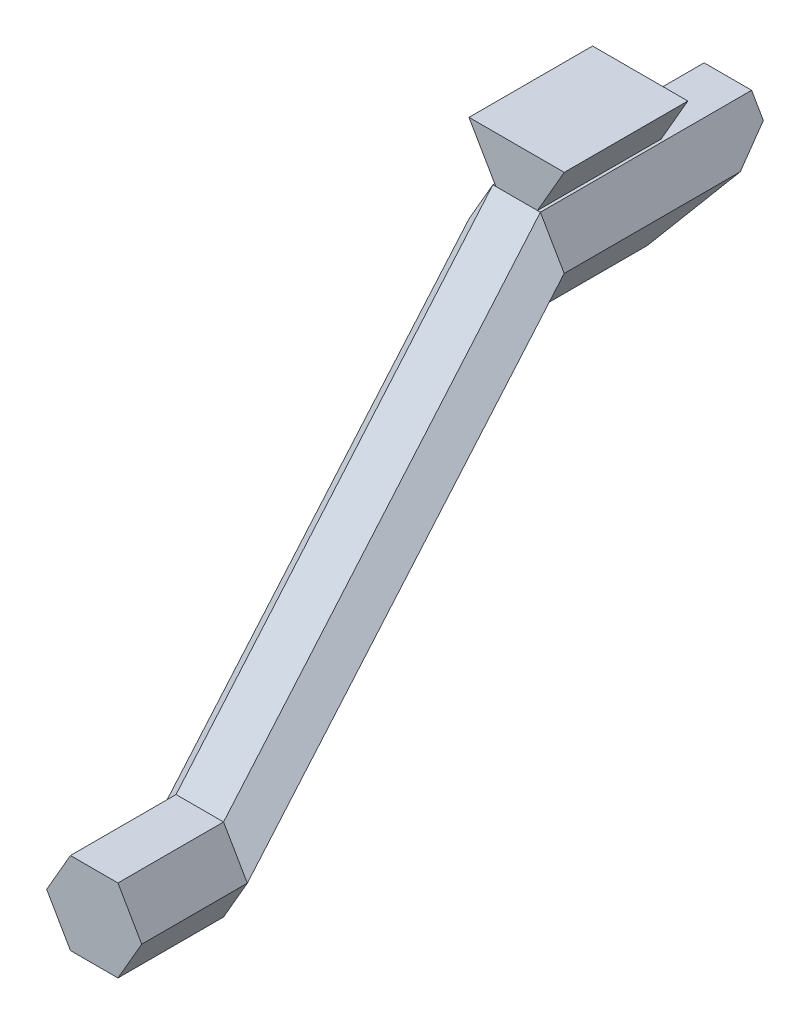
ISO-10303-21;
HEADER;
FILE_DESCRIPTION(('STEP AP214'),'2;1');
FILE_NAME('part.step','',(''),(''),'','','');
FILE_SCHEMA(('AUTOMOTIVE_DESIGN { 1 0 10303 214 1 1 1 1 }'));
ENDSEC;
DATA;
#1=APPLICATION_CONTEXT('core data for automotive mechanical design processes');
#2=APPLICATION_PROTOCOL_DEFINITION('international standard','automotive_design',2000,#1);
#3=PRODUCT_CONTEXT('',#1,'mechanical');
#4=PRODUCT('Part','Part','',(#3));
#5=PRODUCT_RELATED_PRODUCT_CATEGORY('part','',(#4));
#6=PRODUCT_DEFINITION_FORMATION('','',#4);
#7=PRODUCT_DEFINITION_CONTEXT('part definition',#1,'design');
#8=PRODUCT_DEFINITION('design','',#6,#7);
#9=PRODUCT_DEFINITION_SHAPE('','',#8);
#10=(LENGTH_UNIT() NAMED_UNIT(*) SI_UNIT(.MILLI.,.METRE.));
#11=(NAMED_UNIT(*) PLANE_ANGLE_UNIT() SI_UNIT($,.RADIAN.));
#12=(NAMED_UNIT(*) SI_UNIT($,.STERADIAN.) SOLID_ANGLE_UNIT());
#13=UNCERTAINTY_MEASURE_WITH_UNIT(LENGTH_MEASURE(1.E-05),#10,'distance_accuracy_value','');
#14=(GEOMETRIC_REPRESENTATION_CONTEXT(3) GLOBAL_UNCERTAINTY_ASSIGNED_CONTEXT((#13)) GLOBAL_UNIT_ASSIGNED_CONTEXT((#10,
#11,#12)) REPRESENTATION_CONTEXT('',''));
#15=CARTESIAN_POINT('',(0.,0.,0.));
#16=DIRECTION('',(0.,0.,1.));
#17=DIRECTION('',(1.,0.,0.));
#18=AXIS2_PLACEMENT_3D('',#15,#16,#17);
#19=CARTESIAN_POINT('',(2.85750000000006,-4.94933518262803,25.4));
#20=DIRECTION('',(-0.866025403784442,0.499999999999995,0.));
#21=DIRECTION('',(-0.499999999999995,-0.866025403784442,0.));
#22=AXIS2_PLACEMENT_3D('',#19,#20,#21);
#23=PLANE('',#22);
#24=DIRECTION('',(0.,0.,-1.));
#25=VECTOR('',#24,1.);
#26=CARTESIAN_POINT('',(2.85750000000006,-4.94933518262803,25.4));
#27=LINE('',#26,#25);
#28=CARTESIAN_POINT('',(2.85750000000002,-4.94933518262805,25.4));
#29=VERTEX_POINT('',#28);
#30=CARTESIAN_POINT('',(2.85750000000006,-4.94933518262803,12.5400000000001));
#31=VERTEX_POINT('',#30);
#32=EDGE_CURVE('E426',#29,#31,#27,.T.);
#33=ORIENTED_EDGE('',*,*,#32,.T.);
#34=DIRECTION('',(-0.283104064772028,-0.490350624014429,0.824262309000124));
#35=VECTOR('',#34,1.);
#36=CARTESIAN_POINT('',(2.39945468583216,-5.74269293893569,13.8736067378148));
#37=LINE('',#36,#35);
#38=CARTESIAN_POINT('',(5.715,0.,4.22034005493903));
#39=VERTEX_POINT('',#38);
#40=EDGE_CURVE('E337',#31,#39,#37,.F.);
#41=ORIENTED_EDGE('',*,*,#40,.T.);
#42=DIRECTION('',(0.,0.,-1.));
#43=VECTOR('',#42,1.);
#44=CARTESIAN_POINT('',(5.715,0.,25.4));
#45=LINE('',#44,#43);
#46=CARTESIAN_POINT('',(5.71499999999998,0.,25.4));
#47=VERTEX_POINT('',#46);
#48=EDGE_CURVE('E338',#47,#39,#45,.T.);
#49=ORIENTED_EDGE('',*,*,#48,.F.);
#50=DIRECTION('',(0.500000000000003,0.866025403784437,0.));
#51=VECTOR('',#50,1.);
#52=CARTESIAN_POINT('',(2.85750000000002,-4.94933518262801,25.4));
#53=LINE('',#52,#51);
#54=EDGE_CURVE('E433',#29,#47,#53,.T.);
#55=ORIENTED_EDGE('',*,*,#54,.F.);
#56=EDGE_LOOP('',(#33,#41,#49,#55));
#57=FACE_BOUND('',#56,.T.);
#58=ADVANCED_FACE('F47',(#57),#23,.F.);
#59=CARTESIAN_POINT('',(5.715,0.,25.4));
#60=DIRECTION('',(-0.866025403784438,-0.500000000000001,0.));
#61=DIRECTION('',(0.500000000000001,-0.866025403784438,0.));
#62=AXIS2_PLACEMENT_3D('',#59,#60,#61);
#63=PLANE('',#62);
#64=ORIENTED_EDGE('',*,*,#48,.T.);
#65=DIRECTION('',(0.283104064772029,-0.490350624014424,0.824262309000126));
#66=VECTOR('',#65,1.);
#67=CARTESIAN_POINT('',(7.65640937166418,-3.36261967001273,9.87278652437068));
#68=LINE('',#67,#66);
#69=CARTESIAN_POINT('',(4.26546699184535,2.510664817372,0.));
#70=VERTEX_POINT('',#69);
#71=EDGE_CURVE('E340',#39,#70,#68,.F.);
#72=ORIENTED_EDGE('',*,*,#71,.T.);
#73=DIRECTION('',(-0.500000000000001,0.866025403784438,0.));
#74=VECTOR('',#73,1.);
#75=CARTESIAN_POINT('',(5.715,0.,0.));
#76=LINE('',#75,#74);
#77=CARTESIAN_POINT('',(2.85749999999999,4.94933518262807,0.));
#78=VERTEX_POINT('',#77);
#79=EDGE_CURVE('E310',#70,#78,#76,.T.);
#80=ORIENTED_EDGE('',*,*,#79,.T.);
#81=DIRECTION('',(0.,0.,-1.));
#82=VECTOR('',#81,1.);
#83=CARTESIAN_POINT('',(2.85749999999999,4.94933518262807,25.4));
#84=LINE('',#83,#82);
#85=CARTESIAN_POINT('',(2.85749999999999,4.94933518262807,25.4));
#86=VERTEX_POINT('',#85);
#87=EDGE_CURVE('E424',#86,#78,#84,.T.);
#88=ORIENTED_EDGE('',*,*,#87,.F.);
#89=DIRECTION('',(-0.499999999999991,0.866025403784444,0.));
#90=VECTOR('',#89,1.);
#91=CARTESIAN_POINT('',(5.71499999999994,0.,25.4));
#92=LINE('',#91,#90);
#93=EDGE_CURVE('E436',#47,#86,#92,.T.);
#94=ORIENTED_EDGE('',*,*,#93,.F.);
#95=EDGE_LOOP('',(#64,#72,#80,#88,#94));
#96=FACE_BOUND('',#95,.T.);
#97=ADVANCED_FACE('F382',(#96),#63,.F.);
#98=CARTESIAN_POINT('',(-2.85750000000002,4.94933518262805,25.4));
#99=DIRECTION('',(0.866025403784441,-0.499999999999995,0.));
#100=DIRECTION('',(0.499999999999995,0.866025403784441,0.));
#101=AXIS2_PLACEMENT_3D('',#98,#99,#100);
#102=PLANE('',#101);
#103=DIRECTION('',(-0.499999999999995,-0.866025403784441,0.));
#104=VECTOR('',#103,1.);
#105=CARTESIAN_POINT('',(-2.85750000000002,4.94933518262805,0.));
#106=LINE('',#105,#104);
#107=CARTESIAN_POINT('',(-2.85750000000002,4.94933518262805,0.));
#108=VERTEX_POINT('',#107);
#109=CARTESIAN_POINT('',(-4.2654669918454,2.51066481737191,0.));
#110=VERTEX_POINT('',#109);
#111=EDGE_CURVE('E414',#108,#110,#106,.T.);
#112=ORIENTED_EDGE('',*,*,#111,.T.);
#113=DIRECTION('',(0.283104064772028,0.490350624014429,-0.824262309000124));
#114=VECTOR('',#113,1.);
#115=CARTESIAN_POINT('',(-8.11445468583209,-4.15597742632049,11.2063932621853));
#116=LINE('',#115,#114);
#117=CARTESIAN_POINT('',(-5.715,0.,4.2203400549389));
#118=VERTEX_POINT('',#117);
#119=EDGE_CURVE('E344',#110,#118,#116,.F.);
#120=ORIENTED_EDGE('',*,*,#119,.T.);
#121=DIRECTION('',(0.,0.,-1.));
#122=VECTOR('',#121,1.);
#123=CARTESIAN_POINT('',(-5.715,0.,25.4));
#124=LINE('',#123,#122);
#125=CARTESIAN_POINT('',(-5.715,0.,25.4));
#126=VERTEX_POINT('',#125);
#127=EDGE_CURVE('E411',#126,#118,#124,.T.);
#128=ORIENTED_EDGE('',*,*,#127,.F.);
#129=DIRECTION('',(-0.499999999999995,-0.866025403784441,0.));
#130=VECTOR('',#129,1.);
#131=CARTESIAN_POINT('',(-2.85750000000002,4.94933518262805,25.4));
#132=LINE('',#131,#130);
#133=CARTESIAN_POINT('',(-2.85750000000002,4.94933518262805,25.4));
#134=VERTEX_POINT('',#133);
#135=EDGE_CURVE('E441',#134,#126,#132,.T.);
#136=ORIENTED_EDGE('',*,*,#135,.F.);
#137=DIRECTION('',(0.,0.,-1.));
#138=VECTOR('',#137,1.);
#139=CARTESIAN_POINT('',(-2.85750000000002,4.94933518262805,25.4));
#140=LINE('',#139,#138);
#141=EDGE_CURVE('E421',#134,#108,#140,.T.);
#142=ORIENTED_EDGE('',*,*,#141,.T.);
#143=EDGE_LOOP('',(#112,#120,#128,#136,#142));
#144=FACE_BOUND('',#143,.T.);
#145=ADVANCED_FACE('F388',(#144),#102,.F.);
#146=CARTESIAN_POINT('',(-5.715,0.,25.4));
#147=DIRECTION('',(0.866025403784434,0.500000000000007,0.));
#148=DIRECTION('',(-0.500000000000007,0.866025403784435,0.));
#149=AXIS2_PLACEMENT_3D('',#146,#147,#148);
#150=PLANE('',#149);
#151=ORIENTED_EDGE('',*,*,#127,.T.);
#152=DIRECTION('',(-0.283104064772034,0.490350624014423,-0.824262309000125));
#153=VECTOR('',#152,1.);
#154=CARTESIAN_POINT('',(-2.85749999999995,-4.94933518262809,12.5400000000001));
#155=LINE('',#154,#153);
#156=CARTESIAN_POINT('',(-2.85749999999995,-4.94933518262809,12.5400000000001));
#157=VERTEX_POINT('',#156);
#158=EDGE_CURVE('E346',#118,#157,#155,.F.);
#159=ORIENTED_EDGE('',*,*,#158,.T.);
#160=DIRECTION('',(0.,0.,-1.));
#161=VECTOR('',#160,1.);
#162=CARTESIAN_POINT('',(-2.85749999999995,-4.94933518262809,25.4));
#163=LINE('',#162,#161);
#164=CARTESIAN_POINT('',(-2.85749999999995,-4.94933518262809,25.4));
#165=VERTEX_POINT('',#164);
#166=EDGE_CURVE('E422',#165,#157,#163,.T.);
#167=ORIENTED_EDGE('',*,*,#166,.F.);
#168=DIRECTION('',(0.500000000000007,-0.866025403784435,0.));
#169=VECTOR('',#168,1.);
#170=CARTESIAN_POINT('',(-5.715,0.,25.4));
#171=LINE('',#170,#169);
#172=EDGE_CURVE('E419',#126,#165,#171,.T.);
#173=ORIENTED_EDGE('',*,*,#172,.F.);
#174=EDGE_LOOP('',(#151,#159,#167,#173));
#175=FACE_BOUND('',#174,.T.);
#176=ADVANCED_FACE('F416',(#175),#150,.F.);
#177=CARTESIAN_POINT('',(-2.85749999999995,-4.94933518262809,25.4));
#178=DIRECTION('',(0.,1.,0.));
#179=DIRECTION('',(-1.,0.,0.));
#180=AXIS2_PLACEMENT_3D('',#177,#178,#179);
#181=PLANE('',#180);
#182=ORIENTED_EDGE('',*,*,#166,.T.);
#183=DIRECTION('',(1.,0.,0.));
#184=VECTOR('',#183,1.);
#185=CARTESIAN_POINT('',(-2.85749999999995,-4.94933518262809,12.5400000000001));
#186=LINE('',#185,#184);
#187=EDGE_CURVE('E334',#157,#31,#186,.T.);
#188=ORIENTED_EDGE('',*,*,#187,.T.);
#189=ORIENTED_EDGE('',*,*,#32,.F.);
#190=DIRECTION('',(1.,0.,0.));
#191=VECTOR('',#190,1.);
#192=CARTESIAN_POINT('',(-1.01546060534387E-13,-4.94933518262808,25.4));
#193=LINE('',#192,#191);
#194=EDGE_CURVE('E437',#165,#29,#193,.T.);
#195=ORIENTED_EDGE('',*,*,#194,.F.);
#196=EDGE_LOOP('',(#182,#188,#189,#195));
#197=FACE_BOUND('',#196,.T.);
#198=ADVANCED_FACE('F513',(#197),#181,.F.);
#199=CARTESIAN_POINT('',(0.,0.,0.));
#200=DIRECTION('',(0.,0.,1.));
#201=DIRECTION('',(1.,0.,0.));
#202=AXIS2_PLACEMENT_3D('',#199,#200,#201);
#203=PLANE('',#202);
#204=ORIENTED_EDGE('',*,*,#111,.F.);
#205=DIRECTION('',(-1.,0.,0.));
#206=VECTOR('',#205,1.);
#207=CARTESIAN_POINT('',(-2.85750000000002,4.94933518262805,0.));
#208=LINE('',#207,#206);
#209=EDGE_CURVE('E213',#78,#108,#208,.T.);
#210=ORIENTED_EDGE('',*,*,#209,.F.);
#211=ORIENTED_EDGE('',*,*,#79,.F.);
#212=DIRECTION('',(-1.,0.,0.));
#213=VECTOR('',#212,1.);
#214=CARTESIAN_POINT('',(0.,2.51066481737195,0.));
#215=LINE('',#214,#213);
#216=EDGE_CURVE('E342',#70,#110,#215,.T.);
#217=ORIENTED_EDGE('',*,*,#216,.T.);
#218=EDGE_LOOP('',(#204,#210,#211,#217));
#219=FACE_BOUND('',#218,.T.);
#220=ADVANCED_FACE('F280',(#219),#203,.F.);
#221=CARTESIAN_POINT('',(-6.37581244308027,3.68107703031502,4.29458986870087));
#222=DIRECTION('',(-0.748054471431039,0.43188945044922,0.503871025524092));
#223=DIRECTION('',(0.558660819127343,0.,0.82939621965136));
#224=AXIS2_PLACEMENT_3D('',#221,#222,#223);
#225=PLANE('',#224);
#226=DIRECTION('',(0.,-0.759256602365298,0.650791373455967));
#227=VECTOR('',#226,1.);
#228=CARTESIAN_POINT('',(5.715,0.,25.4));
#229=LINE('',#228,#227);
#230=CARTESIAN_POINT('',(5.71499999999999,-44.4500000000002,63.5));
#231=VERTEX_POINT('',#230);
#232=EDGE_CURVE('E236',#47,#231,#229,.T.);
#233=ORIENTED_EDGE('',*,*,#232,.T.);
#234=DIRECTION('',(0.500000000000006,0.866025403784435,0.));
#235=VECTOR('',#234,1.);
#236=CARTESIAN_POINT('',(23.5336645991093,-13.5871675913144,63.5));
#237=LINE('',#236,#235);
#238=CARTESIAN_POINT('',(2.85750000000006,-49.399335182628,63.5));
#239=VERTEX_POINT('',#238);
#240=EDGE_CURVE('E262',#239,#231,#237,.T.);
#241=ORIENTED_EDGE('',*,*,#240,.F.);
#242=DIRECTION('',(0.,-0.759256602365297,0.650791373455969));
#243=VECTOR('',#242,1.);
#244=CARTESIAN_POINT('',(2.85750000000006,-4.94933518262803,25.4));
#245=LINE('',#244,#243);
#246=EDGE_CURVE('E233',#29,#239,#245,.T.);
#247=ORIENTED_EDGE('',*,*,#246,.F.);
#248=ORIENTED_EDGE('',*,*,#54,.T.);
#249=EDGE_LOOP('',(#233,#241,#247,#248));
#250=FACE_BOUND('',#249,.T.);
#251=ADVANCED_FACE('F269',(#250),#225,.F.);
#252=CARTESIAN_POINT('',(-1.01546060534387E-13,10.4543992167693,12.1967990862308));
#253=DIRECTION('',(0.,0.650791373455969,0.759256602365297));
#254=DIRECTION('',(0.,-0.759256602365297,0.650791373455969));
#255=AXIS2_PLACEMENT_3D('',#252,#253,#254);
#256=PLANE('',#255);
#257=ORIENTED_EDGE('',*,*,#246,.T.);
#258=DIRECTION('',(1.,0.,0.));
#259=VECTOR('',#258,1.);
#260=CARTESIAN_POINT('',(4.79827465624927E-13,-49.3993351826281,63.5));
#261=LINE('',#260,#259);
#262=CARTESIAN_POINT('',(-2.85749999999995,-49.3993351826281,63.5));
#263=VERTEX_POINT('',#262);
#264=EDGE_CURVE('E229',#263,#239,#261,.T.);
#265=ORIENTED_EDGE('',*,*,#264,.F.);
#266=DIRECTION('',(0.,-0.759256602365297,0.650791373455969));
#267=VECTOR('',#266,1.);
#268=CARTESIAN_POINT('',(-2.85749999999995,-4.94933518262809,25.4));
#269=LINE('',#268,#267);
#270=EDGE_CURVE('E227',#165,#263,#269,.T.);
#271=ORIENTED_EDGE('',*,*,#270,.F.);
#272=ORIENTED_EDGE('',*,*,#194,.T.);
#273=EDGE_LOOP('',(#257,#265,#271,#272));
#274=FACE_BOUND('',#273,.T.);
#275=ADVANCED_FACE('F279',(#274),#256,.F.);
#276=CARTESIAN_POINT('',(12.771874619246,7.37384524947759,8.60281945772386));
#277=DIRECTION('',(-0.748054471431055,-0.431889450449209,-0.503871025524077));
#278=DIRECTION('',(-0.558660819127323,0.,0.829396219651373));
#279=AXIS2_PLACEMENT_3D('',#276,#277,#278);
#280=PLANE('',#279);
#281=DIRECTION('',(0.,-0.759256602365297,0.650791373455969));
#282=VECTOR('',#281,1.);
#283=CARTESIAN_POINT('',(2.85749999999999,4.94933518262807,25.4));
#284=LINE('',#283,#282);
#285=CARTESIAN_POINT('',(2.85749999999998,-39.5006648173719,63.5));
#286=VERTEX_POINT('',#285);
#287=EDGE_CURVE('E235',#86,#286,#284,.T.);
#288=ORIENTED_EDGE('',*,*,#287,.T.);
#289=DIRECTION('',(-0.499999999999988,0.866025403784446,0.));
#290=VECTOR('',#289,1.);
#291=CARTESIAN_POINT('',(-14.9611645991089,-8.63783240868552,63.5));
#292=LINE('',#291,#290);
#293=EDGE_CURVE('E311',#231,#286,#292,.T.);
#294=ORIENTED_EDGE('',*,*,#293,.F.);
#295=ORIENTED_EDGE('',*,*,#232,.F.);
#296=ORIENTED_EDGE('',*,*,#93,.T.);
#297=EDGE_LOOP('',(#288,#294,#295,#296));
#298=FACE_BOUND('',#297,.T.);
#299=ADVANCED_FACE('F287',(#298),#280,.F.);
#300=CARTESIAN_POINT('',(0.,14.6467772538189,17.0879067961221));
#301=DIRECTION('',(0.,-0.650791373455969,-0.759256602365296));
#302=DIRECTION('',(0.,0.759256602365296,-0.650791373455969));
#303=AXIS2_PLACEMENT_3D('',#300,#301,#302);
#304=PLANE('',#303);
#305=DIRECTION('',(0.,-0.759256602365296,0.650791373455969));
#306=VECTOR('',#305,1.);
#307=CARTESIAN_POINT('',(-2.85750000000002,4.94933518262805,25.4));
#308=LINE('',#307,#306);
#309=CARTESIAN_POINT('',(-2.85750000000002,-39.5006648173719,63.5));
#310=VERTEX_POINT('',#309);
#311=EDGE_CURVE('E246',#134,#310,#308,.T.);
#312=ORIENTED_EDGE('',*,*,#311,.T.);
#313=DIRECTION('',(-1.,0.,0.));
#314=VECTOR('',#313,1.);
#315=CARTESIAN_POINT('',(0.,-39.5006648173719,63.5));
#316=LINE('',#315,#314);
#317=EDGE_CURVE('E499',#286,#310,#316,.T.);
#318=ORIENTED_EDGE('',*,*,#317,.F.);
#319=ORIENTED_EDGE('',*,*,#287,.F.);
#320=DIRECTION('',(1.,0.,0.));
#321=VECTOR('',#320,1.);
#322=CARTESIAN_POINT('',(0.,4.94933518262806,25.4));
#323=LINE('',#322,#321);
#324=CARTESIAN_POINT('',(2.50189999999999,4.94933518262807,25.4));
#325=VERTEX_POINT('',#324);
#326=EDGE_CURVE('E443',#86,#325,#323,.F.);
#327=ORIENTED_EDGE('',*,*,#326,.T.);
#328=CARTESIAN_POINT('',(-2.50190000000001,4.94933518262807,25.4));
#329=VERTEX_POINT('',#328);
#330=EDGE_CURVE('E446',#325,#329,#323,.F.);
#331=ORIENTED_EDGE('',*,*,#330,.T.);
#332=DIRECTION('',(-1.,0.,0.));
#333=VECTOR('',#332,1.);
#334=CARTESIAN_POINT('',(-3.01804272067733E-13,4.94933518262823,25.4));
#335=LINE('',#334,#333);
#336=EDGE_CURVE('E193',#329,#134,#335,.T.);
#337=ORIENTED_EDGE('',*,*,#336,.T.);
#338=EDGE_LOOP('',(#312,#318,#319,#327,#331,#337));
#339=FACE_BOUND('',#338,.T.);
#340=ADVANCED_FACE('F582',(#339),#304,.F.);
#341=CARTESIAN_POINT('',(-12.771874619246,7.37384524947774,8.60281945772402));
#342=DIRECTION('',(0.748054471431049,-0.431889450449214,-0.503871025524082));
#343=DIRECTION('',(-0.55866081912733,0.,-0.829396219651368));
#344=AXIS2_PLACEMENT_3D('',#341,#342,#343);
#345=PLANE('',#344);
#346=DIRECTION('',(0.,-0.759256602365296,0.650791373455969));
#347=VECTOR('',#346,1.);
#348=CARTESIAN_POINT('',(-5.715,0.,25.4));
#349=LINE('',#348,#347);
#350=CARTESIAN_POINT('',(-5.71499999999999,-44.45,63.5));
#351=VERTEX_POINT('',#350);
#352=EDGE_CURVE('E230',#126,#351,#349,.T.);
#353=ORIENTED_EDGE('',*,*,#352,.T.);
#354=DIRECTION('',(-0.499999999999995,-0.866025403784442,0.));
#355=VECTOR('',#354,1.);
#356=CARTESIAN_POINT('',(14.961164599109,-8.63783240868577,63.5));
#357=LINE('',#356,#355);
#358=EDGE_CURVE('E491',#310,#351,#357,.T.);
#359=ORIENTED_EDGE('',*,*,#358,.F.);
#360=ORIENTED_EDGE('',*,*,#311,.F.);
#361=ORIENTED_EDGE('',*,*,#135,.T.);
#362=EDGE_LOOP('',(#353,#359,#360,#361));
#363=FACE_BOUND('',#362,.T.);
#364=ADVANCED_FACE('F521',(#363),#345,.F.);
#365=CARTESIAN_POINT('',(6.37581244308026,3.68107703031502,4.29458986870085));
#366=DIRECTION('',(0.748054471431038,0.431889450449221,0.503871025524091));
#367=DIRECTION('',(0.558660819127342,0.,-0.82939621965136));
#368=AXIS2_PLACEMENT_3D('',#365,#366,#367);
#369=PLANE('',#368);
#370=ORIENTED_EDGE('',*,*,#270,.T.);
#371=DIRECTION('',(0.500000000000007,-0.866025403784435,0.));
#372=VECTOR('',#371,1.);
#373=CARTESIAN_POINT('',(-23.5336645991093,-13.5871675913144,63.5));
#374=LINE('',#373,#372);
#375=EDGE_CURVE('E333',#351,#263,#374,.T.);
#376=ORIENTED_EDGE('',*,*,#375,.F.);
#377=ORIENTED_EDGE('',*,*,#352,.F.);
#378=ORIENTED_EDGE('',*,*,#172,.T.);
#379=EDGE_LOOP('',(#370,#376,#377,#378));
#380=FACE_BOUND('',#379,.T.);
#381=ADVANCED_FACE('F517',(#380),#369,.F.);
#382=CARTESIAN_POINT('',(4.79827465624927E-13,-49.3993351826281,76.2));
#383=DIRECTION('',(0.,1.,0.));
#384=DIRECTION('',(-1.,0.,0.));
#385=AXIS2_PLACEMENT_3D('',#382,#383,#384);
#386=PLANE('',#385);
#387=ORIENTED_EDGE('',*,*,#264,.T.);
#388=DIRECTION('',(0.,0.,-1.));
#389=VECTOR('',#388,1.);
#390=CARTESIAN_POINT('',(2.85750000000006,-49.399335182628,76.2));
#391=LINE('',#390,#389);
#392=CARTESIAN_POINT('',(2.85750000000006,-49.399335182628,76.2));
#393=VERTEX_POINT('',#392);
#394=EDGE_CURVE('E241',#393,#239,#391,.T.);
#395=ORIENTED_EDGE('',*,*,#394,.F.);
#396=DIRECTION('',(1.,0.,0.));
#397=VECTOR('',#396,1.);
#398=CARTESIAN_POINT('',(4.79827465624927E-13,-49.3993351826281,76.2));
#399=LINE('',#398,#397);
#400=CARTESIAN_POINT('',(-2.85749999999995,-49.3993351826281,76.2));
#401=VERTEX_POINT('',#400);
#402=EDGE_CURVE('E206',#401,#393,#399,.T.);
#403=ORIENTED_EDGE('',*,*,#402,.F.);
#404=DIRECTION('',(0.,0.,-1.));
#405=VECTOR('',#404,1.);
#406=CARTESIAN_POINT('',(-2.85749999999995,-49.3993351826281,76.2));
#407=LINE('',#406,#405);
#408=EDGE_CURVE('E226',#401,#263,#407,.T.);
#409=ORIENTED_EDGE('',*,*,#408,.T.);
#410=EDGE_LOOP('',(#387,#395,#403,#409));
#411=FACE_BOUND('',#410,.T.);
#412=ADVANCED_FACE('F281',(#411),#386,.F.);
#413=CARTESIAN_POINT('',(23.5336645991093,-13.5871675913144,76.2));
#414=DIRECTION('',(-0.866025403784435,0.500000000000006,0.));
#415=DIRECTION('',(-0.500000000000006,-0.866025403784435,0.));
#416=AXIS2_PLACEMENT_3D('',#413,#414,#415);
#417=PLANE('',#416);
#418=ORIENTED_EDGE('',*,*,#240,.T.);
#419=DIRECTION('',(0.,0.,-1.));
#420=VECTOR('',#419,1.);
#421=CARTESIAN_POINT('',(5.71499999999999,-44.4500000000002,76.2));
#422=LINE('',#421,#420);
#423=CARTESIAN_POINT('',(5.71499999999999,-44.4500000000002,76.2));
#424=VERTEX_POINT('',#423);
#425=EDGE_CURVE('E316',#424,#231,#422,.T.);
#426=ORIENTED_EDGE('',*,*,#425,.F.);
#427=DIRECTION('',(0.500000000000006,0.866025403784435,0.));
#428=VECTOR('',#427,1.);
#429=CARTESIAN_POINT('',(23.5336645991093,-13.5871675913144,76.2));
#430=LINE('',#429,#428);
#431=EDGE_CURVE('E210',#393,#424,#430,.T.);
#432=ORIENTED_EDGE('',*,*,#431,.F.);
#433=ORIENTED_EDGE('',*,*,#394,.T.);
#434=EDGE_LOOP('',(#418,#426,#432,#433));
#435=FACE_BOUND('',#434,.T.);
#436=ADVANCED_FACE('F558',(#435),#417,.F.);
#437=CARTESIAN_POINT('',(-14.9611645991089,-8.63783240868552,76.2));
#438=DIRECTION('',(-0.866025403784446,-0.499999999999988,0.));
#439=DIRECTION('',(0.499999999999988,-0.866025403784446,0.));
#440=AXIS2_PLACEMENT_3D('',#437,#438,#439);
#441=PLANE('',#440);
#442=ORIENTED_EDGE('',*,*,#293,.T.);
#443=DIRECTION('',(0.,0.,-1.));
#444=VECTOR('',#443,1.);
#445=CARTESIAN_POINT('',(2.85749999999998,-39.5006648173719,76.2));
#446=LINE('',#445,#444);
#447=CARTESIAN_POINT('',(2.85749999999998,-39.5006648173719,76.2));
#448=VERTEX_POINT('',#447);
#449=EDGE_CURVE('E529',#448,#286,#446,.T.);
#450=ORIENTED_EDGE('',*,*,#449,.F.);
#451=DIRECTION('',(-0.499999999999988,0.866025403784446,0.));
#452=VECTOR('',#451,1.);
#453=CARTESIAN_POINT('',(-14.9611645991089,-8.63783240868552,76.2));
#454=LINE('',#453,#452);
#455=EDGE_CURVE('E218',#424,#448,#454,.T.);
#456=ORIENTED_EDGE('',*,*,#455,.F.);
#457=ORIENTED_EDGE('',*,*,#425,.T.);
#458=EDGE_LOOP('',(#442,#450,#456,#457));
#459=FACE_BOUND('',#458,.T.);
#460=ADVANCED_FACE('F550',(#459),#441,.F.);
#461=CARTESIAN_POINT('',(0.,-39.5006648173719,76.2));
#462=DIRECTION('',(0.,-1.,0.));
#463=DIRECTION('',(1.,0.,0.));
#464=AXIS2_PLACEMENT_3D('',#461,#462,#463);
#465=PLANE('',#464);
#466=ORIENTED_EDGE('',*,*,#317,.T.);
#467=DIRECTION('',(0.,0.,-1.));
#468=VECTOR('',#467,1.);
#469=CARTESIAN_POINT('',(-2.85750000000002,-39.5006648173719,76.2));
#470=LINE('',#469,#468);
#471=CARTESIAN_POINT('',(-2.85750000000002,-39.5006648173719,76.2));
#472=VERTEX_POINT('',#471);
#473=EDGE_CURVE('E500',#472,#310,#470,.T.);
#474=ORIENTED_EDGE('',*,*,#473,.F.);
#475=DIRECTION('',(-1.,0.,0.));
#476=VECTOR('',#475,1.);
#477=CARTESIAN_POINT('',(0.,-39.5006648173719,76.2));
#478=LINE('',#477,#476);
#479=EDGE_CURVE('E220',#448,#472,#478,.T.);
#480=ORIENTED_EDGE('',*,*,#479,.F.);
#481=ORIENTED_EDGE('',*,*,#449,.T.);
#482=EDGE_LOOP('',(#466,#474,#480,#481));
#483=FACE_BOUND('',#482,.T.);
#484=ADVANCED_FACE('F480',(#483),#465,.F.);
#485=CARTESIAN_POINT('',(14.961164599109,-8.63783240868577,76.2));
#486=DIRECTION('',(0.866025403784441,-0.499999999999995,0.));
#487=DIRECTION('',(0.499999999999995,0.866025403784442,0.));
#488=AXIS2_PLACEMENT_3D('',#485,#486,#487);
#489=PLANE('',#488);
#490=ORIENTED_EDGE('',*,*,#358,.T.);
#491=DIRECTION('',(0.,0.,-1.));
#492=VECTOR('',#491,1.);
#493=CARTESIAN_POINT('',(-5.71499999999999,-44.45,76.2));
#494=LINE('',#493,#492);
#495=CARTESIAN_POINT('',(-5.71499999999999,-44.45,76.2));
#496=VERTEX_POINT('',#495);
#497=EDGE_CURVE('E450',#496,#351,#494,.T.);
#498=ORIENTED_EDGE('',*,*,#497,.F.);
#499=DIRECTION('',(-0.499999999999995,-0.866025403784442,0.));
#500=VECTOR('',#499,1.);
#501=CARTESIAN_POINT('',(14.961164599109,-8.63783240868577,76.2));
#502=LINE('',#501,#500);
#503=EDGE_CURVE('E222',#472,#496,#502,.T.);
#504=ORIENTED_EDGE('',*,*,#503,.F.);
#505=ORIENTED_EDGE('',*,*,#473,.T.);
#506=EDGE_LOOP('',(#490,#498,#504,#505));
#507=FACE_BOUND('',#506,.T.);
#508=ADVANCED_FACE('F475',(#507),#489,.F.);
#509=CARTESIAN_POINT('',(-23.5336645991093,-13.5871675913144,76.2));
#510=DIRECTION('',(0.866025403784435,0.500000000000007,0.));
#511=DIRECTION('',(-0.500000000000007,0.866025403784435,0.));
#512=AXIS2_PLACEMENT_3D('',#509,#510,#511);
#513=PLANE('',#512);
#514=ORIENTED_EDGE('',*,*,#375,.T.);
#515=ORIENTED_EDGE('',*,*,#408,.F.);
#516=DIRECTION('',(0.500000000000007,-0.866025403784435,0.));
#517=VECTOR('',#516,1.);
#518=CARTESIAN_POINT('',(-23.5336645991093,-13.5871675913144,76.2));
#519=LINE('',#518,#517);
#520=EDGE_CURVE('E224',#496,#401,#519,.T.);
#521=ORIENTED_EDGE('',*,*,#520,.F.);
#522=ORIENTED_EDGE('',*,*,#497,.T.);
#523=EDGE_LOOP('',(#514,#515,#521,#522));
#524=FACE_BOUND('',#523,.T.);
#525=ADVANCED_FACE('F464',(#524),#513,.F.);
#526=CARTESIAN_POINT('',(0.,0.,76.2));
#527=DIRECTION('',(0.,0.,1.));
#528=DIRECTION('',(1.,0.,0.));
#529=AXIS2_PLACEMENT_3D('',#526,#527,#528);
#530=PLANE('',#529);
#531=ORIENTED_EDGE('',*,*,#402,.T.);
#532=ORIENTED_EDGE('',*,*,#431,.T.);
#533=ORIENTED_EDGE('',*,*,#455,.T.);
#534=ORIENTED_EDGE('',*,*,#479,.T.);
#535=ORIENTED_EDGE('',*,*,#503,.T.);
#536=ORIENTED_EDGE('',*,*,#520,.T.);
#537=EDGE_LOOP('',(#531,#532,#533,#534,#535,#536));
#538=FACE_BOUND('',#537,.T.);
#539=ADVANCED_FACE('F474',(#538),#530,.T.);
#540=CARTESIAN_POINT('',(-6.08373330423163,10.5373351826281,25.4));
#541=DIRECTION('',(0.,1.,0.));
#542=DIRECTION('',(-1.,0.,0.));
#543=AXIS2_PLACEMENT_3D('',#540,#541,#542);
#544=PLANE('',#543);
#545=DIRECTION('',(0.,0.,-1.));
#546=VECTOR('',#545,1.);
#547=CARTESIAN_POINT('',(5.72813330423162,10.5373351826281,76.200025));
#548=LINE('',#547,#546);
#549=CARTESIAN_POINT('',(5.72813330423162,10.5373351826281,25.4));
#550=VERTEX_POINT('',#549);
#551=CARTESIAN_POINT('',(5.72813330423162,10.5373351826281,10.541));
#552=VERTEX_POINT('',#551);
#553=EDGE_CURVE('E194',#550,#552,#548,.T.);
#554=ORIENTED_EDGE('',*,*,#553,.T.);
#555=DIRECTION('',(-1.,0.,0.));
#556=VECTOR('',#555,1.);
#557=CARTESIAN_POINT('',(-5.72813330423102,10.5373351826281,10.541));
#558=LINE('',#557,#556);
#559=CARTESIAN_POINT('',(-5.72813330423102,10.5373351826281,10.541));
#560=VERTEX_POINT('',#559);
#561=EDGE_CURVE('E201',#552,#560,#558,.T.);
#562=ORIENTED_EDGE('',*,*,#561,.T.);
#563=DIRECTION('',(0.,0.,-1.));
#564=VECTOR('',#563,1.);
#565=CARTESIAN_POINT('',(-5.72813330423102,10.5373351826281,76.200025));
#566=LINE('',#565,#564);
#567=CARTESIAN_POINT('',(-5.72813330423102,10.5373351826281,25.4));
#568=VERTEX_POINT('',#567);
#569=EDGE_CURVE('E185',#568,#560,#566,.T.);
#570=ORIENTED_EDGE('',*,*,#569,.F.);
#571=DIRECTION('',(1.,0.,0.));
#572=VECTOR('',#571,1.);
#573=CARTESIAN_POINT('',(-6.08373330423163,10.5373351826281,25.4));
#574=LINE('',#573,#572);
#575=EDGE_CURVE('E199',#568,#550,#574,.T.);
#576=ORIENTED_EDGE('',*,*,#575,.T.);
#577=EDGE_LOOP('',(#554,#562,#570,#576));
#578=FACE_BOUND('',#577,.T.);
#579=ADVANCED_FACE('F198',(#578),#544,.T.);
#580=CARTESIAN_POINT('',(0.,0.,25.4));
#581=DIRECTION('',(0.,0.,-1.));
#582=DIRECTION('',(-1.,0.,0.));
#583=AXIS2_PLACEMENT_3D('',#580,#581,#582);
#584=PLANE('',#583);
#585=ORIENTED_EDGE('',*,*,#330,.F.);
#586=DIRECTION('',(0.500000000000001,0.866025403784438,0.));
#587=VECTOR('',#586,1.);
#588=CARTESIAN_POINT('',(-0.266700000000018,0.153979316792884,25.4));
#589=LINE('',#588,#587);
#590=EDGE_CURVE('E205',#325,#550,#589,.T.);
#591=ORIENTED_EDGE('',*,*,#590,.T.);
#592=ORIENTED_EDGE('',*,*,#575,.F.);
#593=DIRECTION('',(0.49999999999993,-0.866025403784479,0.));
#594=VECTOR('',#593,1.);
#595=CARTESIAN_POINT('',(0.266699999999619,0.153979316792625,25.4));
#596=LINE('',#595,#594);
#597=EDGE_CURVE('E181',#568,#329,#596,.T.);
#598=ORIENTED_EDGE('',*,*,#597,.T.);
#599=EDGE_LOOP('',(#585,#591,#592,#598));
#600=FACE_BOUND('',#599,.T.);
#601=ADVANCED_FACE('F204',(#600),#584,.F.);
#602=CARTESIAN_POINT('',(-2.85749999999995,-4.94933518262809,12.5400000000001));
#603=DIRECTION('',(0.,0.859421950806478,0.511266965950263));
#604=DIRECTION('',(1.,0.,0.));
#605=AXIS2_PLACEMENT_3D('',#602,#603,#604);
#606=PLANE('',#605);
#607=ORIENTED_EDGE('',*,*,#119,.F.);
#608=ORIENTED_EDGE('',*,*,#216,.F.);
#609=ORIENTED_EDGE('',*,*,#71,.F.);
#610=ORIENTED_EDGE('',*,*,#40,.F.);
#611=ORIENTED_EDGE('',*,*,#187,.F.);
#612=ORIENTED_EDGE('',*,*,#158,.F.);
#613=EDGE_LOOP('',(#607,#608,#609,#610,#611,#612));
#614=FACE_BOUND('',#613,.T.);
#615=ADVANCED_FACE('F393',(#614),#606,.F.);
#616=CARTESIAN_POINT('',(-2.85750000000002,4.94933518262805,10.16));
#617=DIRECTION('',(0.,-1.,0.));
#618=DIRECTION('',(1.,0.,0.));
#619=AXIS2_PLACEMENT_3D('',#616,#617,#618);
#620=PLANE('',#619);
#621=ORIENTED_EDGE('',*,*,#209,.T.);
#622=ORIENTED_EDGE('',*,*,#141,.F.);
#623=ORIENTED_EDGE('',*,*,#336,.F.);
#624=DIRECTION('',(0.,0.,-1.));
#625=VECTOR('',#624,1.);
#626=CARTESIAN_POINT('',(-2.50190000000001,4.94933518262807,76.200025));
#627=LINE('',#626,#625);
#628=CARTESIAN_POINT('',(-2.50190000000001,4.94933518262807,10.541));
#629=VERTEX_POINT('',#628);
#630=EDGE_CURVE('E188',#329,#629,#627,.T.);
#631=ORIENTED_EDGE('',*,*,#630,.T.);
#632=DIRECTION('',(-0.755928946018449,0.,0.654653670707984));
#633=VECTOR('',#632,1.);
#634=CARTESIAN_POINT('',(-2.51655389780466,4.94933518262805,10.5536906477633));
#635=LINE('',#634,#633);
#636=CARTESIAN_POINT('',(-2.06195909487754,4.94933518262806,10.16));
#637=VERTEX_POINT('',#636);
#638=EDGE_CURVE('E56',#629,#637,#635,.F.);
#639=ORIENTED_EDGE('',*,*,#638,.T.);
#640=DIRECTION('',(-1.,0.,0.));
#641=VECTOR('',#640,1.);
#642=CARTESIAN_POINT('',(-2.85750000000002,4.94933518262805,10.16));
#643=LINE('',#642,#641);
#644=CARTESIAN_POINT('',(2.0619590948775,4.94933518262807,10.16));
#645=VERTEX_POINT('',#644);
#646=EDGE_CURVE('E207',#645,#637,#643,.T.);
#647=ORIENTED_EDGE('',*,*,#646,.F.);
#648=DIRECTION('',(-0.755928946018466,0.,-0.654653670707964));
#649=VECTOR('',#648,1.);
#650=CARTESIAN_POINT('',(-0.749160387909742,4.94933518262806,7.72549911483296));
#651=LINE('',#650,#649);
#652=CARTESIAN_POINT('',(2.50189999999999,4.94933518262807,10.541));
#653=VERTEX_POINT('',#652);
#654=EDGE_CURVE('E12',#645,#653,#651,.F.);
#655=ORIENTED_EDGE('',*,*,#654,.T.);
#656=DIRECTION('',(0.,0.,-1.));
#657=VECTOR('',#656,1.);
#658=CARTESIAN_POINT('',(2.50189999999999,4.94933518262807,76.200025));
#659=LINE('',#658,#657);
#660=EDGE_CURVE('E594',#325,#653,#659,.T.);
#661=ORIENTED_EDGE('',*,*,#660,.F.);
#662=ORIENTED_EDGE('',*,*,#326,.F.);
#663=ORIENTED_EDGE('',*,*,#87,.T.);
#664=EDGE_LOOP('',(#621,#622,#623,#631,#639,#647,#655,#661,#662,#663));
#665=FACE_BOUND('',#664,.T.);
#666=ADVANCED_FACE('F373',(#665),#620,.F.);
#667=CARTESIAN_POINT('',(0.,0.,10.16));
#668=DIRECTION('',(0.,0.,1.));
#669=DIRECTION('',(1.,0.,0.));
#670=AXIS2_PLACEMENT_3D('',#667,#668,#669);
#671=PLANE('',#670);
#672=ORIENTED_EDGE('',*,*,#646,.T.);
#673=DIRECTION('',(-0.49999999999993,0.866025403784479,0.));
#674=VECTOR('',#673,1.);
#675=CARTESIAN_POINT('',(0.596655678841498,0.344479316792593,10.16));
#676=LINE('',#675,#674);
#677=CARTESIAN_POINT('',(-5.06822194654736,10.1563351826281,10.16));
#678=VERTEX_POINT('',#677);
#679=EDGE_CURVE('E354',#637,#678,#676,.T.);
#680=ORIENTED_EDGE('',*,*,#679,.T.);
#681=DIRECTION('',(1.,0.,0.));
#682=VECTOR('',#681,1.);
#683=CARTESIAN_POINT('',(5.72813330423162,10.1563351826281,10.16));
#684=LINE('',#683,#682);
#685=CARTESIAN_POINT('',(5.06822194654789,10.1563351826281,10.16));
#686=VERTEX_POINT('',#685);
#687=EDGE_CURVE('E350',#678,#686,#684,.T.);
#688=ORIENTED_EDGE('',*,*,#687,.T.);
#689=DIRECTION('',(-0.500000000000001,-0.866025403784438,0.));
#690=VECTOR('',#689,1.);
#691=CARTESIAN_POINT('',(-0.596655678841883,0.344479316792881,10.16));
#692=LINE('',#691,#690);
#693=EDGE_CURVE('E352',#686,#645,#692,.T.);
#694=ORIENTED_EDGE('',*,*,#693,.T.);
#695=EDGE_LOOP('',(#672,#680,#688,#694));
#696=FACE_BOUND('',#695,.T.);
#697=ADVANCED_FACE('F371',(#696),#671,.F.);
#698=CARTESIAN_POINT('',(-5.72813330423102,10.5373351826281,76.200025));
#699=DIRECTION('',(0.866025403784479,0.49999999999993,0.));
#700=DIRECTION('',(-0.49999999999993,0.866025403784479,0.));
#701=AXIS2_PLACEMENT_3D('',#698,#699,#700);
#702=PLANE('',#701);
#703=ORIENTED_EDGE('',*,*,#569,.T.);
#704=DIRECTION('',(0.49999999999993,-0.866025403784479,0.));
#705=VECTOR('',#704,1.);
#706=CARTESIAN_POINT('',(-5.72813330423102,10.5373351826281,10.541));
#707=LINE('',#706,#705);
#708=EDGE_CURVE('E348',#560,#629,#707,.T.);
#709=ORIENTED_EDGE('',*,*,#708,.T.);
#710=ORIENTED_EDGE('',*,*,#630,.F.);
#711=ORIENTED_EDGE('',*,*,#597,.F.);
#712=EDGE_LOOP('',(#703,#709,#710,#711));
#713=FACE_BOUND('',#712,.T.);
#714=ADVANCED_FACE('F183',(#713),#702,.F.);
#715=CARTESIAN_POINT('',(2.50189999999999,4.94933518262807,76.200025));
#716=DIRECTION('',(-0.866025403784438,0.500000000000001,0.));
#717=DIRECTION('',(-0.500000000000001,-0.866025403784438,0.));
#718=AXIS2_PLACEMENT_3D('',#715,#716,#717);
#719=PLANE('',#718);
#720=ORIENTED_EDGE('',*,*,#660,.T.);
#721=DIRECTION('',(0.500000000000001,0.866025403784438,0.));
#722=VECTOR('',#721,1.);
#723=CARTESIAN_POINT('',(2.50189999999999,4.94933518262807,10.541));
#724=LINE('',#723,#722);
#725=EDGE_CURVE('E64',#653,#552,#724,.T.);
#726=ORIENTED_EDGE('',*,*,#725,.T.);
#727=ORIENTED_EDGE('',*,*,#553,.F.);
#728=ORIENTED_EDGE('',*,*,#590,.F.);
#729=EDGE_LOOP('',(#720,#726,#727,#728));
#730=FACE_BOUND('',#729,.T.);
#731=ADVANCED_FACE('F596',(#730),#719,.F.);
#732=CARTESIAN_POINT('',(2.50189999999999,4.94933518262807,10.541));
#733=DIRECTION('',(-0.612372435695784,0.353553390593269,0.707106781186559));
#734=DIRECTION('',(0.500000000000001,0.866025403784438,0.));
#735=AXIS2_PLACEMENT_3D('',#732,#733,#734);
#736=PLANE('',#735);
#737=ORIENTED_EDGE('',*,*,#654,.F.);
#738=ORIENTED_EDGE('',*,*,#693,.F.);
#739=DIRECTION('',(0.774596669241489,0.447213595499962,0.447213595499945));
#740=VECTOR('',#739,1.);
#741=CARTESIAN_POINT('',(2.02728877861911,8.40065159953672,8.40431641690873));
#742=LINE('',#741,#740);
#743=EDGE_CURVE('E51',#552,#686,#742,.F.);
#744=ORIENTED_EDGE('',*,*,#743,.F.);
#745=ORIENTED_EDGE('',*,*,#725,.F.);
#746=EDGE_LOOP('',(#737,#738,#744,#745));
#747=FACE_BOUND('',#746,.T.);
#748=ADVANCED_FACE('F49',(#747),#736,.F.);
#749=CARTESIAN_POINT('',(0.,10.1563351826281,10.16));
#750=DIRECTION('',(0.,0.707106781186534,-0.707106781186561));
#751=DIRECTION('',(-1.,0.,0.));
#752=AXIS2_PLACEMENT_3D('',#749,#750,#751);
#753=PLANE('',#752);
#754=ORIENTED_EDGE('',*,*,#743,.T.);
#755=ORIENTED_EDGE('',*,*,#687,.F.);
#756=DIRECTION('',(0.774596669241459,-0.447213595499988,-0.44721359549997));
#757=VECTOR('',#756,1.);
#758=CARTESIAN_POINT('',(-2.02728877861913,8.40065159953687,8.40431641690888));
#759=LINE('',#758,#757);
#760=EDGE_CURVE('E358',#560,#678,#759,.T.);
#761=ORIENTED_EDGE('',*,*,#760,.F.);
#762=ORIENTED_EDGE('',*,*,#561,.F.);
#763=EDGE_LOOP('',(#754,#755,#761,#762));
#764=FACE_BOUND('',#763,.T.);
#765=ADVANCED_FACE('F367',(#764),#753,.T.);
#766=CARTESIAN_POINT('',(-5.72813330423102,10.5373351826281,10.541));
#767=DIRECTION('',(0.612372435695813,0.353553390593219,0.707106781186559));
#768=DIRECTION('',(0.49999999999993,-0.866025403784479,0.));
#769=AXIS2_PLACEMENT_3D('',#766,#767,#768);
#770=PLANE('',#769);
#771=ORIENTED_EDGE('',*,*,#760,.T.);
#772=ORIENTED_EDGE('',*,*,#679,.F.);
#773=ORIENTED_EDGE('',*,*,#638,.F.);
#774=ORIENTED_EDGE('',*,*,#708,.F.);
#775=EDGE_LOOP('',(#771,#772,#773,#774));
#776=FACE_BOUND('',#775,.T.);
#777=ADVANCED_FACE('F374',(#776),#770,.F.);
#778=CLOSED_SHELL('',(#58,#97,#145,#176,#198,#220,#251,#275,#299,#340,#364,#381,#412,#436,#460,
#484,#508,#525,#539,#579,#601,#615,#666,#697,#714,#731,#748,#765,#777));
#779=MANIFOLD_SOLID_BREP('B2',#778);
#780=ADVANCED_BREP_SHAPE_REPRESENTATION('',(#18,#779),#14);
#781=SHAPE_DEFINITION_REPRESENTATION(#9,#780);
ENDSEC;
END-ISO-10303-21;
